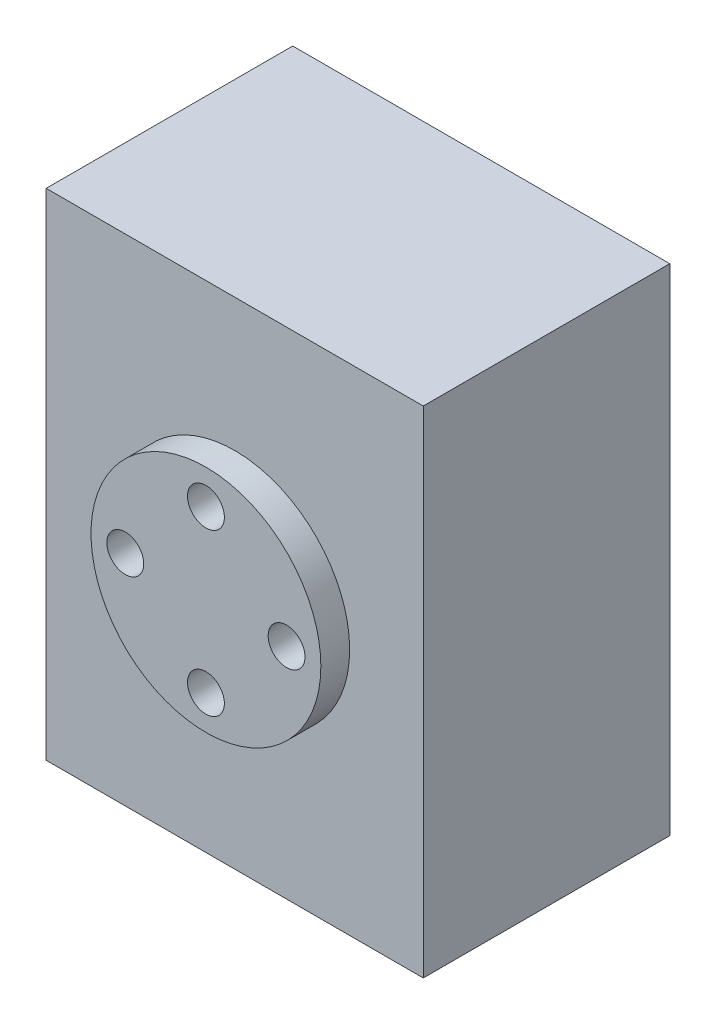
ISO-10303-21;
HEADER;
FILE_DESCRIPTION(('STEP AP214'),'2;1');
FILE_NAME('part.step','',(''),(''),'','','');
FILE_SCHEMA(('AUTOMOTIVE_DESIGN { 1 0 10303 214 1 1 1 1 }'));
ENDSEC;
DATA;
#1=APPLICATION_CONTEXT('core data for automotive mechanical design processes');
#2=APPLICATION_PROTOCOL_DEFINITION('international standard','automotive_design',2000,#1);
#3=PRODUCT_CONTEXT('',#1,'mechanical');
#4=PRODUCT('Part','Part','',(#3));
#5=PRODUCT_RELATED_PRODUCT_CATEGORY('part','',(#4));
#6=PRODUCT_DEFINITION_FORMATION('','',#4);
#7=PRODUCT_DEFINITION_CONTEXT('part definition',#1,'design');
#8=PRODUCT_DEFINITION('design','',#6,#7);
#9=PRODUCT_DEFINITION_SHAPE('','',#8);
#10=(LENGTH_UNIT() NAMED_UNIT(*) SI_UNIT(.MILLI.,.METRE.));
#11=(NAMED_UNIT(*) PLANE_ANGLE_UNIT() SI_UNIT($,.RADIAN.));
#12=(NAMED_UNIT(*) SI_UNIT($,.STERADIAN.) SOLID_ANGLE_UNIT());
#13=UNCERTAINTY_MEASURE_WITH_UNIT(LENGTH_MEASURE(1.E-05),#10,'distance_accuracy_value','');
#14=(GEOMETRIC_REPRESENTATION_CONTEXT(3) GLOBAL_UNCERTAINTY_ASSIGNED_CONTEXT((#13)) GLOBAL_UNIT_ASSIGNED_CONTEXT((#10,
#11,#12)) REPRESENTATION_CONTEXT('',''));
#15=CARTESIAN_POINT('',(0.,0.,0.));
#16=DIRECTION('',(0.,0.,1.));
#17=DIRECTION('',(1.,0.,0.));
#18=AXIS2_PLACEMENT_3D('',#15,#16,#17);
#19=CARTESIAN_POINT('',(0.,0.,-2.5));
#20=DIRECTION('',(0.,0.,1.));
#21=DIRECTION('',(1.,0.,0.));
#22=AXIS2_PLACEMENT_3D('',#19,#20,#21);
#23=PLANE('',#22);
#24=CARTESIAN_POINT('',(7.,0.,-2.5));
#25=DIRECTION('',(0.,0.,1.));
#26=DIRECTION('',(1.,0.,0.));
#27=AXIS2_PLACEMENT_3D('',#24,#25,#26);
#28=CIRCLE('',#27,1.6);
#29=CARTESIAN_POINT('',(8.6,0.,-2.5));
#30=VERTEX_POINT('',#29);
#31=EDGE_CURVE('E183',#30,#30,#28,.T.);
#32=ORIENTED_EDGE('',*,*,#31,.T.);
#33=EDGE_LOOP('',(#32));
#34=FACE_BOUND('',#33,.T.);
#35=CARTESIAN_POINT('',(0.,-7.,-2.5));
#36=DIRECTION('',(0.,0.,1.));
#37=DIRECTION('',(1.,0.,0.));
#38=AXIS2_PLACEMENT_3D('',#35,#36,#37);
#39=CIRCLE('',#38,1.6);
#40=CARTESIAN_POINT('',(1.59999999999998,-7.,-2.5));
#41=VERTEX_POINT('',#40);
#42=EDGE_CURVE('E187',#41,#41,#39,.T.);
#43=ORIENTED_EDGE('',*,*,#42,.T.);
#44=EDGE_LOOP('',(#43));
#45=FACE_BOUND('',#44,.T.);
#46=CARTESIAN_POINT('',(-7.,0.,-2.5));
#47=DIRECTION('',(0.,0.,1.));
#48=DIRECTION('',(1.,0.,0.));
#49=AXIS2_PLACEMENT_3D('',#46,#47,#48);
#50=CIRCLE('',#49,1.6);
#51=CARTESIAN_POINT('',(-5.4,0.,-2.5));
#52=VERTEX_POINT('',#51);
#53=EDGE_CURVE('E433',#52,#52,#50,.T.);
#54=ORIENTED_EDGE('',*,*,#53,.T.);
#55=EDGE_LOOP('',(#54));
#56=FACE_BOUND('',#55,.T.);
#57=CARTESIAN_POINT('',(0.,7.,-2.5));
#58=DIRECTION('',(0.,0.,1.));
#59=DIRECTION('',(1.,0.,0.));
#60=AXIS2_PLACEMENT_3D('',#57,#58,#59);
#61=CIRCLE('',#60,1.6);
#62=CARTESIAN_POINT('',(1.60000000000008,7.,-2.5));
#63=VERTEX_POINT('',#62);
#64=EDGE_CURVE('E429',#63,#63,#61,.T.);
#65=ORIENTED_EDGE('',*,*,#64,.T.);
#66=EDGE_LOOP('',(#65));
#67=FACE_BOUND('',#66,.T.);
#68=DIRECTION('',(0.,-1.,0.));
#69=VECTOR('',#68,1.);
#70=CARTESIAN_POINT('',(12.365,17.5,-2.5));
#71=LINE('',#70,#69);
#72=CARTESIAN_POINT('',(12.365,16.4,-2.5));
#73=VERTEX_POINT('',#72);
#74=CARTESIAN_POINT('',(12.365,-16.,-2.5));
#75=VERTEX_POINT('',#74);
#76=EDGE_CURVE('E336',#73,#75,#71,.T.);
#77=ORIENTED_EDGE('',*,*,#76,.T.);
#78=DIRECTION('',(1.,0.,0.));
#79=VECTOR('',#78,1.);
#80=CARTESIAN_POINT('',(-12.365,-16.,-2.5));
#81=LINE('',#80,#79);
#82=CARTESIAN_POINT('',(-12.365,-16.,-2.5));
#83=VERTEX_POINT('',#82);
#84=EDGE_CURVE('E214',#83,#75,#81,.T.);
#85=ORIENTED_EDGE('',*,*,#84,.F.);
#86=DIRECTION('',(0.,-1.,0.));
#87=VECTOR('',#86,1.);
#88=CARTESIAN_POINT('',(-12.365,17.5,-2.5));
#89=LINE('',#88,#87);
#90=CARTESIAN_POINT('',(-12.365,16.4,-2.5));
#91=VERTEX_POINT('',#90);
#92=EDGE_CURVE('E328',#91,#83,#89,.T.);
#93=ORIENTED_EDGE('',*,*,#92,.F.);
#94=DIRECTION('',(1.,0.,0.));
#95=VECTOR('',#94,1.);
#96=CARTESIAN_POINT('',(-12.365,16.4,-2.5));
#97=LINE('',#96,#95);
#98=CARTESIAN_POINT('',(-7.16499999999999,16.4,-2.5));
#99=VERTEX_POINT('',#98);
#100=EDGE_CURVE('E230',#91,#99,#97,.T.);
#101=ORIENTED_EDGE('',*,*,#100,.T.);
#102=DIRECTION('',(0.,-1.,0.));
#103=VECTOR('',#102,1.);
#104=CARTESIAN_POINT('',(-7.16499999999999,17.5,-2.5));
#105=LINE('',#104,#103);
#106=CARTESIAN_POINT('',(-7.16499999999999,17.5,-2.5));
#107=VERTEX_POINT('',#106);
#108=EDGE_CURVE('E253',#107,#99,#105,.T.);
#109=ORIENTED_EDGE('',*,*,#108,.F.);
#110=DIRECTION('',(-1.,0.,0.));
#111=VECTOR('',#110,1.);
#112=CARTESIAN_POINT('',(12.365,17.5,-2.5));
#113=LINE('',#112,#111);
#114=CARTESIAN_POINT('',(7.16500000000001,17.5,-2.5));
#115=VERTEX_POINT('',#114);
#116=EDGE_CURVE('E332',#115,#107,#113,.T.);
#117=ORIENTED_EDGE('',*,*,#116,.F.);
#118=DIRECTION('',(0.,-1.,0.));
#119=VECTOR('',#118,1.);
#120=CARTESIAN_POINT('',(7.16500000000001,17.5,-2.5));
#121=LINE('',#120,#119);
#122=CARTESIAN_POINT('',(7.16500000000001,16.4,-2.5));
#123=VERTEX_POINT('',#122);
#124=EDGE_CURVE('E222',#115,#123,#121,.T.);
#125=ORIENTED_EDGE('',*,*,#124,.T.);
#126=DIRECTION('',(-1.,0.,0.));
#127=VECTOR('',#126,1.);
#128=CARTESIAN_POINT('',(12.365,16.4,-2.5));
#129=LINE('',#128,#127);
#130=EDGE_CURVE('E226',#73,#123,#129,.T.);
#131=ORIENTED_EDGE('',*,*,#130,.F.);
#132=EDGE_LOOP('',(#77,#85,#93,#101,#109,#117,#125,#131));
#133=FACE_BOUND('',#132,.T.);
#134=ADVANCED_FACE('F45',(#34,#45,#56,#67,#133),#23,.F.);
#135=CARTESIAN_POINT('',(-12.365,17.5,-21.4));
#136=DIRECTION('',(1.,0.,0.));
#137=DIRECTION('',(0.,1.,0.));
#138=AXIS2_PLACEMENT_3D('',#135,#136,#137);
#139=PLANE('',#138);
#140=ORIENTED_EDGE('',*,*,#92,.T.);
#141=DIRECTION('',(0.,0.,1.));
#142=VECTOR('',#141,1.);
#143=CARTESIAN_POINT('',(-12.365,-16.,-21.4));
#144=LINE('',#143,#142);
#145=CARTESIAN_POINT('',(-12.365,-16.,-21.4));
#146=VERTEX_POINT('',#145);
#147=EDGE_CURVE('E238',#146,#83,#144,.T.);
#148=ORIENTED_EDGE('',*,*,#147,.F.);
#149=DIRECTION('',(0.,1.,0.));
#150=VECTOR('',#149,1.);
#151=CARTESIAN_POINT('',(-12.365,17.5,-21.4));
#152=LINE('',#151,#150);
#153=CARTESIAN_POINT('',(-12.365,16.4,-21.4));
#154=VERTEX_POINT('',#153);
#155=EDGE_CURVE('E265',#146,#154,#152,.T.);
#156=ORIENTED_EDGE('',*,*,#155,.T.);
#157=DIRECTION('',(0.,0.,1.));
#158=VECTOR('',#157,1.);
#159=CARTESIAN_POINT('',(-12.365,16.4,-21.4));
#160=LINE('',#159,#158);
#161=EDGE_CURVE('E262',#154,#91,#160,.T.);
#162=ORIENTED_EDGE('',*,*,#161,.T.);
#163=EDGE_LOOP('',(#140,#148,#156,#162));
#164=FACE_BOUND('',#163,.T.);
#165=ADVANCED_FACE('F386',(#164),#139,.T.);
#166=CARTESIAN_POINT('',(12.365,17.5,-21.4));
#167=DIRECTION('',(0.,-1.,0.));
#168=DIRECTION('',(0.,0.,-1.));
#169=AXIS2_PLACEMENT_3D('',#166,#167,#168);
#170=PLANE('',#169);
#171=DIRECTION('',(0.,0.,1.));
#172=VECTOR('',#171,1.);
#173=CARTESIAN_POINT('',(7.16500000000001,17.5,-21.4));
#174=LINE('',#173,#172);
#175=CARTESIAN_POINT('',(7.16500000000001,17.5,-21.4));
#176=VERTEX_POINT('',#175);
#177=EDGE_CURVE('E213',#176,#115,#174,.T.);
#178=ORIENTED_EDGE('',*,*,#177,.T.);
#179=ORIENTED_EDGE('',*,*,#116,.T.);
#180=DIRECTION('',(0.,0.,1.));
#181=VECTOR('',#180,1.);
#182=CARTESIAN_POINT('',(-7.16499999999999,17.5,-21.4));
#183=LINE('',#182,#181);
#184=CARTESIAN_POINT('',(-7.16499999999999,17.5,-21.4));
#185=VERTEX_POINT('',#184);
#186=EDGE_CURVE('E266',#185,#107,#183,.T.);
#187=ORIENTED_EDGE('',*,*,#186,.F.);
#188=DIRECTION('',(1.,0.,0.));
#189=VECTOR('',#188,1.);
#190=CARTESIAN_POINT('',(12.365,17.5,-21.4));
#191=LINE('',#190,#189);
#192=EDGE_CURVE('E275',#185,#176,#191,.T.);
#193=ORIENTED_EDGE('',*,*,#192,.T.);
#194=EDGE_LOOP('',(#178,#179,#187,#193));
#195=FACE_BOUND('',#194,.T.);
#196=ADVANCED_FACE('F394',(#195),#170,.T.);
#197=CARTESIAN_POINT('',(12.365,17.5,-21.4));
#198=DIRECTION('',(-1.,0.,0.));
#199=DIRECTION('',(0.,-1.,0.));
#200=AXIS2_PLACEMENT_3D('',#197,#198,#199);
#201=PLANE('',#200);
#202=ORIENTED_EDGE('',*,*,#76,.F.);
#203=DIRECTION('',(0.,0.,1.));
#204=VECTOR('',#203,1.);
#205=CARTESIAN_POINT('',(12.365,16.4,-21.4));
#206=LINE('',#205,#204);
#207=CARTESIAN_POINT('',(12.365,16.4,-21.4));
#208=VERTEX_POINT('',#207);
#209=EDGE_CURVE('E218',#208,#73,#206,.T.);
#210=ORIENTED_EDGE('',*,*,#209,.F.);
#211=DIRECTION('',(0.,-1.,0.));
#212=VECTOR('',#211,1.);
#213=CARTESIAN_POINT('',(12.365,17.5,-21.4));
#214=LINE('',#213,#212);
#215=CARTESIAN_POINT('',(12.365,-16.,-21.4));
#216=VERTEX_POINT('',#215);
#217=EDGE_CURVE('E279',#208,#216,#214,.T.);
#218=ORIENTED_EDGE('',*,*,#217,.T.);
#219=DIRECTION('',(0.,0.,1.));
#220=VECTOR('',#219,1.);
#221=CARTESIAN_POINT('',(12.365,-16.,-21.4));
#222=LINE('',#221,#220);
#223=EDGE_CURVE('E195',#216,#75,#222,.T.);
#224=ORIENTED_EDGE('',*,*,#223,.T.);
#225=EDGE_LOOP('',(#202,#210,#218,#224));
#226=FACE_BOUND('',#225,.T.);
#227=ADVANCED_FACE('F483',(#226),#201,.T.);
#228=CARTESIAN_POINT('',(12.365,-17.5,-21.4));
#229=DIRECTION('',(0.,1.,0.));
#230=DIRECTION('',(0.,0.,1.));
#231=AXIS2_PLACEMENT_3D('',#228,#229,#230);
#232=PLANE('',#231);
#233=DIRECTION('',(-1.,0.,0.));
#234=VECTOR('',#233,1.);
#235=CARTESIAN_POINT('',(-9.165,-17.5,-7.8));
#236=LINE('',#235,#234);
#237=CARTESIAN_POINT('',(9.165,-17.5,-7.8));
#238=VERTEX_POINT('',#237);
#239=CARTESIAN_POINT('',(-9.165,-17.5,-7.8));
#240=VERTEX_POINT('',#239);
#241=EDGE_CURVE('E61',#238,#240,#236,.T.);
#242=ORIENTED_EDGE('',*,*,#241,.F.);
#243=DIRECTION('',(0.,0.,1.));
#244=VECTOR('',#243,1.);
#245=CARTESIAN_POINT('',(9.165,-17.5,-21.4));
#246=LINE('',#245,#244);
#247=CARTESIAN_POINT('',(9.165,-17.5,-21.4));
#248=VERTEX_POINT('',#247);
#249=EDGE_CURVE('E199',#248,#238,#246,.T.);
#250=ORIENTED_EDGE('',*,*,#249,.F.);
#251=DIRECTION('',(-1.,0.,0.));
#252=VECTOR('',#251,1.);
#253=CARTESIAN_POINT('',(12.365,-17.5,-21.4));
#254=LINE('',#253,#252);
#255=CARTESIAN_POINT('',(-9.165,-17.5,-21.4));
#256=VERTEX_POINT('',#255);
#257=EDGE_CURVE('E282',#248,#256,#254,.T.);
#258=ORIENTED_EDGE('',*,*,#257,.T.);
#259=DIRECTION('',(0.,0.,1.));
#260=VECTOR('',#259,1.);
#261=CARTESIAN_POINT('',(-9.165,-17.5,-21.4));
#262=LINE('',#261,#260);
#263=EDGE_CURVE('E170',#256,#240,#262,.T.);
#264=ORIENTED_EDGE('',*,*,#263,.T.);
#265=EDGE_LOOP('',(#242,#250,#258,#264));
#266=FACE_BOUND('',#265,.T.);
#267=ADVANCED_FACE('F403',(#266),#232,.T.);
#268=CARTESIAN_POINT('',(0.,0.,2.5));
#269=DIRECTION('',(0.,0.,-1.));
#270=DIRECTION('',(-1.,0.,0.));
#271=AXIS2_PLACEMENT_3D('',#268,#269,#270);
#272=CYLINDRICAL_SURFACE('',#271,9.975);
#273=CARTESIAN_POINT('',(0.,0.,2.5));
#274=DIRECTION('',(0.,0.,1.));
#275=DIRECTION('',(1.,0.,0.));
#276=AXIS2_PLACEMENT_3D('',#273,#274,#275);
#277=CIRCLE('',#276,9.975);
#278=CARTESIAN_POINT('',(9.975,0.,2.5));
#279=VERTEX_POINT('',#278);
#280=EDGE_CURVE('E11',#279,#279,#277,.T.);
#281=ORIENTED_EDGE('',*,*,#280,.F.);
#282=EDGE_LOOP('',(#281));
#283=FACE_BOUND('',#282,.T.);
#284=CARTESIAN_POINT('',(0.,0.,0.));
#285=DIRECTION('',(0.,0.,1.));
#286=DIRECTION('',(1.,0.,0.));
#287=AXIS2_PLACEMENT_3D('',#284,#285,#286);
#288=CIRCLE('',#287,9.975);
#289=CARTESIAN_POINT('',(9.975,0.,0.));
#290=VERTEX_POINT('',#289);
#291=EDGE_CURVE('E49',#290,#290,#288,.T.);
#292=ORIENTED_EDGE('',*,*,#291,.T.);
#293=EDGE_LOOP('',(#292));
#294=FACE_BOUND('',#293,.T.);
#295=ADVANCED_FACE('F47',(#283,#294),#272,.T.);
#296=CARTESIAN_POINT('',(0.,0.,2.5));
#297=DIRECTION('',(0.,0.,1.));
#298=DIRECTION('',(1.,0.,0.));
#299=AXIS2_PLACEMENT_3D('',#296,#297,#298);
#300=PLANE('',#299);
#301=CARTESIAN_POINT('',(7.,0.,2.5));
#302=DIRECTION('',(0.,0.,1.));
#303=DIRECTION('',(1.,0.,0.));
#304=AXIS2_PLACEMENT_3D('',#301,#302,#303);
#305=CIRCLE('',#304,1.6);
#306=CARTESIAN_POINT('',(8.6,0.,2.5));
#307=VERTEX_POINT('',#306);
#308=EDGE_CURVE('E408',#307,#307,#305,.T.);
#309=ORIENTED_EDGE('',*,*,#308,.F.);
#310=EDGE_LOOP('',(#309));
#311=FACE_BOUND('',#310,.T.);
#312=CARTESIAN_POINT('',(0.,-7.,2.5));
#313=DIRECTION('',(0.,0.,1.));
#314=DIRECTION('',(1.,0.,0.));
#315=AXIS2_PLACEMENT_3D('',#312,#313,#314);
#316=CIRCLE('',#315,1.6);
#317=CARTESIAN_POINT('',(1.59999999999998,-7.,2.5));
#318=VERTEX_POINT('',#317);
#319=EDGE_CURVE('E412',#318,#318,#316,.T.);
#320=ORIENTED_EDGE('',*,*,#319,.F.);
#321=EDGE_LOOP('',(#320));
#322=FACE_BOUND('',#321,.T.);
#323=CARTESIAN_POINT('',(-7.,0.,2.5));
#324=DIRECTION('',(0.,0.,1.));
#325=DIRECTION('',(1.,0.,0.));
#326=AXIS2_PLACEMENT_3D('',#323,#324,#325);
#327=CIRCLE('',#326,1.6);
#328=CARTESIAN_POINT('',(-5.4,0.,2.5));
#329=VERTEX_POINT('',#328);
#330=EDGE_CURVE('E416',#329,#329,#327,.T.);
#331=ORIENTED_EDGE('',*,*,#330,.F.);
#332=EDGE_LOOP('',(#331));
#333=FACE_BOUND('',#332,.T.);
#334=CARTESIAN_POINT('',(0.,7.,2.5));
#335=DIRECTION('',(0.,0.,1.));
#336=DIRECTION('',(1.,0.,0.));
#337=AXIS2_PLACEMENT_3D('',#334,#335,#336);
#338=CIRCLE('',#337,1.6);
#339=CARTESIAN_POINT('',(1.60000000000008,7.,2.5));
#340=VERTEX_POINT('',#339);
#341=EDGE_CURVE('E420',#340,#340,#338,.T.);
#342=ORIENTED_EDGE('',*,*,#341,.F.);
#343=EDGE_LOOP('',(#342));
#344=FACE_BOUND('',#343,.T.);
#345=ORIENTED_EDGE('',*,*,#280,.T.);
#346=EDGE_LOOP('',(#345));
#347=FACE_BOUND('',#346,.T.);
#348=ADVANCED_FACE('F352',(#311,#322,#333,#344,#347),#300,.T.);
#349=CARTESIAN_POINT('',(0.,0.,0.));
#350=DIRECTION('',(0.,0.,1.));
#351=DIRECTION('',(1.,0.,0.));
#352=AXIS2_PLACEMENT_3D('',#349,#350,#351);
#353=PLANE('',#352);
#354=ORIENTED_EDGE('',*,*,#291,.F.);
#355=EDGE_LOOP('',(#354));
#356=FACE_BOUND('',#355,.T.);
#357=DIRECTION('',(1.,0.,0.));
#358=VECTOR('',#357,1.);
#359=CARTESIAN_POINT('',(16.365,21.5,0.));
#360=LINE('',#359,#358);
#361=CARTESIAN_POINT('',(-16.365,21.5,0.));
#362=VERTEX_POINT('',#361);
#363=CARTESIAN_POINT('',(16.365,21.5,0.));
#364=VERTEX_POINT('',#363);
#365=EDGE_CURVE('E286',#362,#364,#360,.T.);
#366=ORIENTED_EDGE('',*,*,#365,.F.);
#367=DIRECTION('',(0.,1.,0.));
#368=VECTOR('',#367,1.);
#369=CARTESIAN_POINT('',(-16.365,21.5,0.));
#370=LINE('',#369,#368);
#371=CARTESIAN_POINT('',(-16.365,-21.5,0.));
#372=VERTEX_POINT('',#371);
#373=EDGE_CURVE('E292',#372,#362,#370,.T.);
#374=ORIENTED_EDGE('',*,*,#373,.F.);
#375=DIRECTION('',(-1.,0.,0.));
#376=VECTOR('',#375,1.);
#377=CARTESIAN_POINT('',(16.365,-21.5,0.));
#378=LINE('',#377,#376);
#379=CARTESIAN_POINT('',(16.365,-21.5,0.));
#380=VERTEX_POINT('',#379);
#381=EDGE_CURVE('E308',#380,#372,#378,.T.);
#382=ORIENTED_EDGE('',*,*,#381,.F.);
#383=DIRECTION('',(0.,-1.,0.));
#384=VECTOR('',#383,1.);
#385=CARTESIAN_POINT('',(16.365,21.5,0.));
#386=LINE('',#385,#384);
#387=EDGE_CURVE('E305',#364,#380,#386,.T.);
#388=ORIENTED_EDGE('',*,*,#387,.F.);
#389=EDGE_LOOP('',(#366,#374,#382,#388));
#390=FACE_BOUND('',#389,.T.);
#391=ADVANCED_FACE('F348',(#356,#390),#353,.T.);
#392=CARTESIAN_POINT('',(0.,0.,-21.4));
#393=DIRECTION('',(0.,0.,1.));
#394=DIRECTION('',(1.,0.,0.));
#395=AXIS2_PLACEMENT_3D('',#392,#393,#394);
#396=PLANE('',#395);
#397=DIRECTION('',(0.,-1.,0.));
#398=VECTOR('',#397,1.);
#399=CARTESIAN_POINT('',(7.16500000000001,17.5,-21.4));
#400=LINE('',#399,#398);
#401=CARTESIAN_POINT('',(7.16500000000001,16.4,-21.4));
#402=VERTEX_POINT('',#401);
#403=EDGE_CURVE('E221',#176,#402,#400,.T.);
#404=ORIENTED_EDGE('',*,*,#403,.F.);
#405=ORIENTED_EDGE('',*,*,#192,.F.);
#406=DIRECTION('',(0.,-1.,0.));
#407=VECTOR('',#406,1.);
#408=CARTESIAN_POINT('',(-7.16499999999999,17.5,-21.4));
#409=LINE('',#408,#407);
#410=CARTESIAN_POINT('',(-7.16499999999999,16.4,-21.4));
#411=VERTEX_POINT('',#410);
#412=EDGE_CURVE('E252',#185,#411,#409,.T.);
#413=ORIENTED_EDGE('',*,*,#412,.T.);
#414=DIRECTION('',(1.,0.,0.));
#415=VECTOR('',#414,1.);
#416=CARTESIAN_POINT('',(-12.365,16.4,-21.4));
#417=LINE('',#416,#415);
#418=EDGE_CURVE('E248',#154,#411,#417,.T.);
#419=ORIENTED_EDGE('',*,*,#418,.F.);
#420=ORIENTED_EDGE('',*,*,#155,.F.);
#421=DIRECTION('',(1.,0.,0.));
#422=VECTOR('',#421,1.);
#423=CARTESIAN_POINT('',(-12.365,-16.,-21.4));
#424=LINE('',#423,#422);
#425=CARTESIAN_POINT('',(-9.165,-16.,-21.4));
#426=VERTEX_POINT('',#425);
#427=EDGE_CURVE('E243',#146,#426,#424,.T.);
#428=ORIENTED_EDGE('',*,*,#427,.T.);
#429=DIRECTION('',(0.,1.,0.));
#430=VECTOR('',#429,1.);
#431=CARTESIAN_POINT('',(-9.165,-17.5,-21.4));
#432=LINE('',#431,#430);
#433=EDGE_CURVE('E167',#256,#426,#432,.T.);
#434=ORIENTED_EDGE('',*,*,#433,.F.);
#435=ORIENTED_EDGE('',*,*,#257,.F.);
#436=DIRECTION('',(0.,1.,0.));
#437=VECTOR('',#436,1.);
#438=CARTESIAN_POINT('',(9.165,-17.5,-21.4));
#439=LINE('',#438,#437);
#440=CARTESIAN_POINT('',(9.165,-16.,-21.4));
#441=VERTEX_POINT('',#440);
#442=EDGE_CURVE('E198',#248,#441,#439,.T.);
#443=ORIENTED_EDGE('',*,*,#442,.T.);
#444=DIRECTION('',(-1.,0.,0.));
#445=VECTOR('',#444,1.);
#446=CARTESIAN_POINT('',(12.365,-16.,-21.4));
#447=LINE('',#446,#445);
#448=EDGE_CURVE('E171',#216,#441,#447,.T.);
#449=ORIENTED_EDGE('',*,*,#448,.F.);
#450=ORIENTED_EDGE('',*,*,#217,.F.);
#451=DIRECTION('',(-1.,0.,0.));
#452=VECTOR('',#451,1.);
#453=CARTESIAN_POINT('',(12.365,16.4,-21.4));
#454=LINE('',#453,#452);
#455=EDGE_CURVE('E227',#208,#402,#454,.T.);
#456=ORIENTED_EDGE('',*,*,#455,.T.);
#457=EDGE_LOOP('',(#404,#405,#413,#419,#420,#428,#434,#435,#443,#449,#450,#456));
#458=FACE_BOUND('',#457,.T.);
#459=DIRECTION('',(1.,0.,0.));
#460=VECTOR('',#459,1.);
#461=CARTESIAN_POINT('',(16.365,21.5,-21.4));
#462=LINE('',#461,#460);
#463=CARTESIAN_POINT('',(-16.365,21.5,-21.4));
#464=VERTEX_POINT('',#463);
#465=CARTESIAN_POINT('',(16.365,21.5,-21.4));
#466=VERTEX_POINT('',#465);
#467=EDGE_CURVE('E287',#464,#466,#462,.T.);
#468=ORIENTED_EDGE('',*,*,#467,.T.);
#469=DIRECTION('',(0.,-1.,0.));
#470=VECTOR('',#469,1.);
#471=CARTESIAN_POINT('',(16.365,21.5,-21.4));
#472=LINE('',#471,#470);
#473=CARTESIAN_POINT('',(16.365,-21.5,-21.4));
#474=VERTEX_POINT('',#473);
#475=EDGE_CURVE('E291',#466,#474,#472,.T.);
#476=ORIENTED_EDGE('',*,*,#475,.T.);
#477=DIRECTION('',(-1.,0.,0.));
#478=VECTOR('',#477,1.);
#479=CARTESIAN_POINT('',(16.365,-21.5,-21.4));
#480=LINE('',#479,#478);
#481=CARTESIAN_POINT('',(-16.365,-21.5,-21.4));
#482=VERTEX_POINT('',#481);
#483=EDGE_CURVE('E295',#474,#482,#480,.T.);
#484=ORIENTED_EDGE('',*,*,#483,.T.);
#485=DIRECTION('',(0.,1.,0.));
#486=VECTOR('',#485,1.);
#487=CARTESIAN_POINT('',(-16.365,21.5,-21.4));
#488=LINE('',#487,#486);
#489=EDGE_CURVE('E298',#482,#464,#488,.T.);
#490=ORIENTED_EDGE('',*,*,#489,.T.);
#491=EDGE_LOOP('',(#468,#476,#484,#490));
#492=FACE_BOUND('',#491,.T.);
#493=ADVANCED_FACE('F351',(#458,#492),#396,.F.);
#494=CARTESIAN_POINT('',(16.365,21.5,-21.4));
#495=DIRECTION('',(0.,-1.,0.));
#496=DIRECTION('',(0.,0.,-1.));
#497=AXIS2_PLACEMENT_3D('',#494,#495,#496);
#498=PLANE('',#497);
#499=ORIENTED_EDGE('',*,*,#365,.T.);
#500=DIRECTION('',(0.,0.,1.));
#501=VECTOR('',#500,1.);
#502=CARTESIAN_POINT('',(16.365,21.5,-21.4));
#503=LINE('',#502,#501);
#504=EDGE_CURVE('E324',#466,#364,#503,.T.);
#505=ORIENTED_EDGE('',*,*,#504,.F.);
#506=ORIENTED_EDGE('',*,*,#467,.F.);
#507=DIRECTION('',(0.,0.,1.));
#508=VECTOR('',#507,1.);
#509=CARTESIAN_POINT('',(-16.365,21.5,-21.4));
#510=LINE('',#509,#508);
#511=EDGE_CURVE('E301',#464,#362,#510,.T.);
#512=ORIENTED_EDGE('',*,*,#511,.T.);
#513=EDGE_LOOP('',(#499,#505,#506,#512));
#514=FACE_BOUND('',#513,.T.);
#515=ADVANCED_FACE('F359',(#514),#498,.F.);
#516=CARTESIAN_POINT('',(16.365,21.5,-21.4));
#517=DIRECTION('',(-1.,0.,0.));
#518=DIRECTION('',(0.,0.,1.));
#519=AXIS2_PLACEMENT_3D('',#516,#517,#518);
#520=PLANE('',#519);
#521=ORIENTED_EDGE('',*,*,#387,.T.);
#522=DIRECTION('',(0.,0.,1.));
#523=VECTOR('',#522,1.);
#524=CARTESIAN_POINT('',(16.365,-21.5,-21.4));
#525=LINE('',#524,#523);
#526=EDGE_CURVE('E320',#474,#380,#525,.T.);
#527=ORIENTED_EDGE('',*,*,#526,.F.);
#528=ORIENTED_EDGE('',*,*,#475,.F.);
#529=ORIENTED_EDGE('',*,*,#504,.T.);
#530=EDGE_LOOP('',(#521,#527,#528,#529));
#531=FACE_BOUND('',#530,.T.);
#532=ADVANCED_FACE('F371',(#531),#520,.F.);
#533=CARTESIAN_POINT('',(16.365,-21.5,-21.4));
#534=DIRECTION('',(0.,1.,0.));
#535=DIRECTION('',(-1.,0.,0.));
#536=AXIS2_PLACEMENT_3D('',#533,#534,#535);
#537=PLANE('',#536);
#538=ORIENTED_EDGE('',*,*,#381,.T.);
#539=DIRECTION('',(0.,0.,1.));
#540=VECTOR('',#539,1.);
#541=CARTESIAN_POINT('',(-16.365,-21.5,-21.4));
#542=LINE('',#541,#540);
#543=EDGE_CURVE('E316',#482,#372,#542,.T.);
#544=ORIENTED_EDGE('',*,*,#543,.F.);
#545=ORIENTED_EDGE('',*,*,#483,.F.);
#546=ORIENTED_EDGE('',*,*,#526,.T.);
#547=EDGE_LOOP('',(#538,#544,#545,#546));
#548=FACE_BOUND('',#547,.T.);
#549=ADVANCED_FACE('F368',(#548),#537,.F.);
#550=CARTESIAN_POINT('',(-16.365,21.5,-21.4));
#551=DIRECTION('',(1.,0.,0.));
#552=DIRECTION('',(0.,0.,-1.));
#553=AXIS2_PLACEMENT_3D('',#550,#551,#552);
#554=PLANE('',#553);
#555=ORIENTED_EDGE('',*,*,#373,.T.);
#556=ORIENTED_EDGE('',*,*,#511,.F.);
#557=ORIENTED_EDGE('',*,*,#489,.F.);
#558=ORIENTED_EDGE('',*,*,#543,.T.);
#559=EDGE_LOOP('',(#555,#556,#557,#558));
#560=FACE_BOUND('',#559,.T.);
#561=ADVANCED_FACE('F364',(#560),#554,.F.);
#562=CARTESIAN_POINT('',(-12.365,16.4,-21.4));
#563=DIRECTION('',(0.,-1.,0.));
#564=DIRECTION('',(0.,0.,-1.));
#565=AXIS2_PLACEMENT_3D('',#562,#563,#564);
#566=PLANE('',#565);
#567=ORIENTED_EDGE('',*,*,#100,.F.);
#568=ORIENTED_EDGE('',*,*,#161,.F.);
#569=ORIENTED_EDGE('',*,*,#418,.T.);
#570=DIRECTION('',(0.,0.,1.));
#571=VECTOR('',#570,1.);
#572=CARTESIAN_POINT('',(-7.16499999999999,16.4,-21.4));
#573=LINE('',#572,#571);
#574=EDGE_CURVE('E256',#411,#99,#573,.T.);
#575=ORIENTED_EDGE('',*,*,#574,.T.);
#576=EDGE_LOOP('',(#567,#568,#569,#575));
#577=FACE_BOUND('',#576,.T.);
#578=ADVANCED_FACE('F477',(#577),#566,.T.);
#579=CARTESIAN_POINT('',(-7.16499999999999,17.5,-21.4));
#580=DIRECTION('',(-1.,0.,0.));
#581=DIRECTION('',(0.,0.,1.));
#582=AXIS2_PLACEMENT_3D('',#579,#580,#581);
#583=PLANE('',#582);
#584=ORIENTED_EDGE('',*,*,#108,.T.);
#585=ORIENTED_EDGE('',*,*,#574,.F.);
#586=ORIENTED_EDGE('',*,*,#412,.F.);
#587=ORIENTED_EDGE('',*,*,#186,.T.);
#588=EDGE_LOOP('',(#584,#585,#586,#587));
#589=FACE_BOUND('',#588,.T.);
#590=ADVANCED_FACE('F463',(#589),#583,.F.);
#591=CARTESIAN_POINT('',(9.165,-17.5,-21.4));
#592=DIRECTION('',(1.,0.,0.));
#593=DIRECTION('',(0.,0.,-1.));
#594=AXIS2_PLACEMENT_3D('',#591,#592,#593);
#595=PLANE('',#594);
#596=ORIENTED_EDGE('',*,*,#249,.T.);
#597=DIRECTION('',(0.,-1.,0.));
#598=VECTOR('',#597,1.);
#599=CARTESIAN_POINT('',(9.165,-17.5,-7.8));
#600=LINE('',#599,#598);
#601=CARTESIAN_POINT('',(9.165,-16.,-7.8));
#602=VERTEX_POINT('',#601);
#603=EDGE_CURVE('E68',#602,#238,#600,.T.);
#604=ORIENTED_EDGE('',*,*,#603,.F.);
#605=DIRECTION('',(0.,0.,1.));
#606=VECTOR('',#605,1.);
#607=CARTESIAN_POINT('',(9.165,-16.,-21.4));
#608=LINE('',#607,#606);
#609=EDGE_CURVE('E177',#441,#602,#608,.T.);
#610=ORIENTED_EDGE('',*,*,#609,.F.);
#611=ORIENTED_EDGE('',*,*,#442,.F.);
#612=EDGE_LOOP('',(#596,#604,#610,#611));
#613=FACE_BOUND('',#612,.T.);
#614=ADVANCED_FACE('F460',(#613),#595,.F.);
#615=CARTESIAN_POINT('',(-12.365,-16.,-21.4));
#616=DIRECTION('',(0.,-1.,0.));
#617=DIRECTION('',(0.,0.,-1.));
#618=AXIS2_PLACEMENT_3D('',#615,#616,#617);
#619=PLANE('',#618);
#620=ORIENTED_EDGE('',*,*,#84,.T.);
#621=ORIENTED_EDGE('',*,*,#223,.F.);
#622=ORIENTED_EDGE('',*,*,#448,.T.);
#623=ORIENTED_EDGE('',*,*,#609,.T.);
#624=DIRECTION('',(1.,0.,0.));
#625=VECTOR('',#624,1.);
#626=CARTESIAN_POINT('',(-9.165,-16.,-7.8));
#627=LINE('',#626,#625);
#628=CARTESIAN_POINT('',(-9.165,-16.,-7.8));
#629=VERTEX_POINT('',#628);
#630=EDGE_CURVE('E174',#629,#602,#627,.T.);
#631=ORIENTED_EDGE('',*,*,#630,.F.);
#632=DIRECTION('',(0.,0.,1.));
#633=VECTOR('',#632,1.);
#634=CARTESIAN_POINT('',(-9.165,-16.,-21.4));
#635=LINE('',#634,#633);
#636=EDGE_CURVE('E161',#426,#629,#635,.T.);
#637=ORIENTED_EDGE('',*,*,#636,.F.);
#638=ORIENTED_EDGE('',*,*,#427,.F.);
#639=ORIENTED_EDGE('',*,*,#147,.T.);
#640=EDGE_LOOP('',(#620,#621,#622,#623,#631,#637,#638,#639));
#641=FACE_BOUND('',#640,.T.);
#642=ADVANCED_FACE('F175',(#641),#619,.F.);
#643=CARTESIAN_POINT('',(-9.165,-17.5,-21.4));
#644=DIRECTION('',(1.,0.,0.));
#645=DIRECTION('',(0.,0.,-1.));
#646=AXIS2_PLACEMENT_3D('',#643,#644,#645);
#647=PLANE('',#646);
#648=DIRECTION('',(0.,1.,0.));
#649=VECTOR('',#648,1.);
#650=CARTESIAN_POINT('',(-9.165,-17.5,-7.8));
#651=LINE('',#650,#649);
#652=EDGE_CURVE('E165',#240,#629,#651,.T.);
#653=ORIENTED_EDGE('',*,*,#652,.F.);
#654=ORIENTED_EDGE('',*,*,#263,.F.);
#655=ORIENTED_EDGE('',*,*,#433,.T.);
#656=ORIENTED_EDGE('',*,*,#636,.T.);
#657=EDGE_LOOP('',(#653,#654,#655,#656));
#658=FACE_BOUND('',#657,.T.);
#659=ADVANCED_FACE('F163',(#658),#647,.T.);
#660=CARTESIAN_POINT('',(12.365,16.4,-21.4));
#661=DIRECTION('',(0.,1.,0.));
#662=DIRECTION('',(0.,0.,1.));
#663=AXIS2_PLACEMENT_3D('',#660,#661,#662);
#664=PLANE('',#663);
#665=ORIENTED_EDGE('',*,*,#130,.T.);
#666=DIRECTION('',(0.,0.,1.));
#667=VECTOR('',#666,1.);
#668=CARTESIAN_POINT('',(7.16500000000001,16.4,-21.4));
#669=LINE('',#668,#667);
#670=EDGE_CURVE('E209',#402,#123,#669,.T.);
#671=ORIENTED_EDGE('',*,*,#670,.F.);
#672=ORIENTED_EDGE('',*,*,#455,.F.);
#673=ORIENTED_EDGE('',*,*,#209,.T.);
#674=EDGE_LOOP('',(#665,#671,#672,#673));
#675=FACE_BOUND('',#674,.T.);
#676=ADVANCED_FACE('F464',(#675),#664,.F.);
#677=CARTESIAN_POINT('',(7.16500000000001,17.5,-21.4));
#678=DIRECTION('',(-1.,0.,0.));
#679=DIRECTION('',(0.,0.,1.));
#680=AXIS2_PLACEMENT_3D('',#677,#678,#679);
#681=PLANE('',#680);
#682=ORIENTED_EDGE('',*,*,#124,.F.);
#683=ORIENTED_EDGE('',*,*,#177,.F.);
#684=ORIENTED_EDGE('',*,*,#403,.T.);
#685=ORIENTED_EDGE('',*,*,#670,.T.);
#686=EDGE_LOOP('',(#682,#683,#684,#685));
#687=FACE_BOUND('',#686,.T.);
#688=ADVANCED_FACE('F459',(#687),#681,.T.);
#689=CARTESIAN_POINT('',(0.,0.,-7.8));
#690=DIRECTION('',(0.,0.,-1.));
#691=DIRECTION('',(-1.,0.,0.));
#692=AXIS2_PLACEMENT_3D('',#689,#690,#691);
#693=PLANE('',#692);
#694=ORIENTED_EDGE('',*,*,#652,.T.);
#695=ORIENTED_EDGE('',*,*,#630,.T.);
#696=ORIENTED_EDGE('',*,*,#603,.T.);
#697=ORIENTED_EDGE('',*,*,#241,.T.);
#698=EDGE_LOOP('',(#694,#695,#696,#697));
#699=FACE_BOUND('',#698,.T.);
#700=ADVANCED_FACE('F181',(#699),#693,.T.);
#701=CARTESIAN_POINT('',(0.,7.,-34.5));
#702=DIRECTION('',(0.,0.,1.));
#703=DIRECTION('',(1.,0.,0.));
#704=AXIS2_PLACEMENT_3D('',#701,#702,#703);
#705=CYLINDRICAL_SURFACE('',#704,1.6);
#706=ORIENTED_EDGE('',*,*,#341,.T.);
#707=EDGE_LOOP('',(#706));
#708=FACE_BOUND('',#707,.T.);
#709=ORIENTED_EDGE('',*,*,#64,.F.);
#710=EDGE_LOOP('',(#709));
#711=FACE_BOUND('',#710,.T.);
#712=ADVANCED_FACE('F453',(#708,#711),#705,.F.);
#713=CARTESIAN_POINT('',(-7.,0.,-34.5));
#714=DIRECTION('',(0.,0.,1.));
#715=DIRECTION('',(1.,0.,0.));
#716=AXIS2_PLACEMENT_3D('',#713,#714,#715);
#717=CYLINDRICAL_SURFACE('',#716,1.6);
#718=ORIENTED_EDGE('',*,*,#330,.T.);
#719=EDGE_LOOP('',(#718));
#720=FACE_BOUND('',#719,.T.);
#721=ORIENTED_EDGE('',*,*,#53,.F.);
#722=EDGE_LOOP('',(#721));
#723=FACE_BOUND('',#722,.T.);
#724=ADVANCED_FACE('F444',(#720,#723),#717,.F.);
#725=CARTESIAN_POINT('',(0.,-7.,-34.5));
#726=DIRECTION('',(0.,0.,1.));
#727=DIRECTION('',(1.,0.,0.));
#728=AXIS2_PLACEMENT_3D('',#725,#726,#727);
#729=CYLINDRICAL_SURFACE('',#728,1.6);
#730=ORIENTED_EDGE('',*,*,#319,.T.);
#731=EDGE_LOOP('',(#730));
#732=FACE_BOUND('',#731,.T.);
#733=ORIENTED_EDGE('',*,*,#42,.F.);
#734=EDGE_LOOP('',(#733));
#735=FACE_BOUND('',#734,.T.);
#736=ADVANCED_FACE('F441',(#732,#735),#729,.F.);
#737=CARTESIAN_POINT('',(7.,0.,-34.5));
#738=DIRECTION('',(0.,0.,1.));
#739=DIRECTION('',(1.,0.,0.));
#740=AXIS2_PLACEMENT_3D('',#737,#738,#739);
#741=CYLINDRICAL_SURFACE('',#740,1.6);
#742=ORIENTED_EDGE('',*,*,#308,.T.);
#743=EDGE_LOOP('',(#742));
#744=FACE_BOUND('',#743,.T.);
#745=ORIENTED_EDGE('',*,*,#31,.F.);
#746=EDGE_LOOP('',(#745));
#747=FACE_BOUND('',#746,.T.);
#748=ADVANCED_FACE('F443',(#744,#747),#741,.F.);
#749=CLOSED_SHELL('',(#134,#165,#196,#227,#267,#295,#348,#391,#493,#515,#532,#549,#561,#578,
#590,#614,#642,#659,#676,#688,#700,#712,#724,#736,#748));
#750=MANIFOLD_SOLID_BREP('B2',#749);
#751=ADVANCED_BREP_SHAPE_REPRESENTATION('',(#18,#750),#14);
#752=SHAPE_DEFINITION_REPRESENTATION(#9,#751);
ENDSEC;
END-ISO-10303-21;
